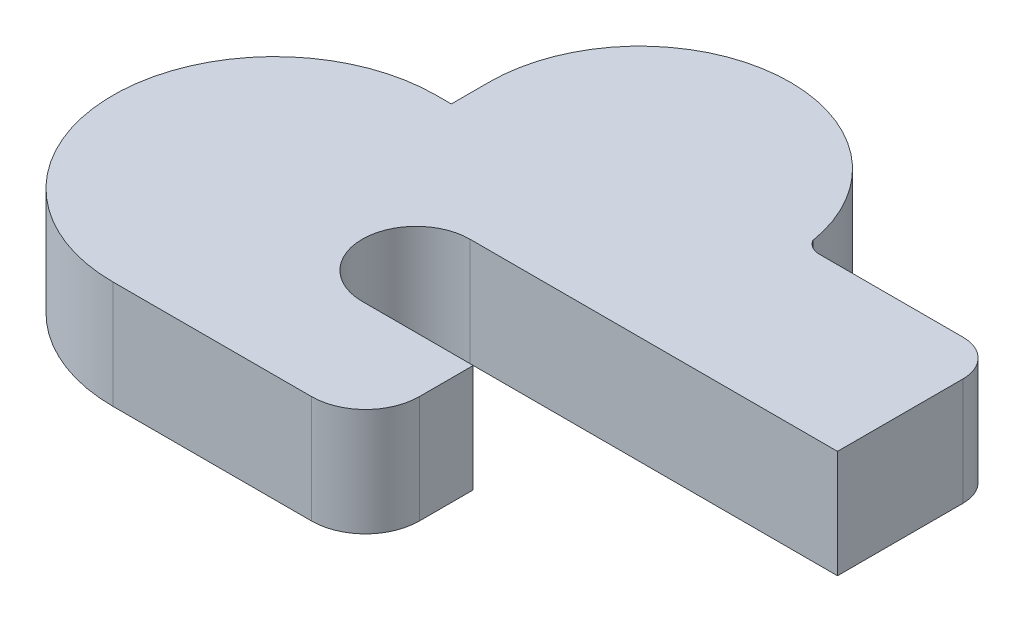
ISO-10303-21;
HEADER;
FILE_DESCRIPTION(('STEP AP214'),'2;1');
FILE_NAME('part.step','',(''),(''),'','','');
FILE_SCHEMA(('AUTOMOTIVE_DESIGN { 1 0 10303 214 1 1 1 1 }'));
ENDSEC;
DATA;
#1=APPLICATION_CONTEXT('core data for automotive mechanical design processes');
#2=APPLICATION_PROTOCOL_DEFINITION('international standard','automotive_design',2000,#1);
#3=PRODUCT_CONTEXT('',#1,'mechanical');
#4=PRODUCT('Part','Part','',(#3));
#5=PRODUCT_RELATED_PRODUCT_CATEGORY('part','',(#4));
#6=PRODUCT_DEFINITION_FORMATION('','',#4);
#7=PRODUCT_DEFINITION_CONTEXT('part definition',#1,'design');
#8=PRODUCT_DEFINITION('design','',#6,#7);
#9=PRODUCT_DEFINITION_SHAPE('','',#8);
#10=(LENGTH_UNIT() NAMED_UNIT(*) SI_UNIT(.MILLI.,.METRE.));
#11=(NAMED_UNIT(*) PLANE_ANGLE_UNIT() SI_UNIT($,.RADIAN.));
#12=(NAMED_UNIT(*) SI_UNIT($,.STERADIAN.) SOLID_ANGLE_UNIT());
#13=UNCERTAINTY_MEASURE_WITH_UNIT(LENGTH_MEASURE(1.E-05),#10,'distance_accuracy_value','');
#14=(GEOMETRIC_REPRESENTATION_CONTEXT(3) GLOBAL_UNCERTAINTY_ASSIGNED_CONTEXT((#13)) GLOBAL_UNIT_ASSIGNED_CONTEXT((#10,
#11,#12)) REPRESENTATION_CONTEXT('',''));
#15=CARTESIAN_POINT('',(0.,0.,0.));
#16=DIRECTION('',(0.,0.,1.));
#17=DIRECTION('',(1.,0.,0.));
#18=AXIS2_PLACEMENT_3D('',#15,#16,#17);
#19=CARTESIAN_POINT('',(0.,3.,1.49999991868153));
#20=DIRECTION('',(-1.,0.,0.));
#21=DIRECTION('',(0.,0.,1.));
#22=AXIS2_PLACEMENT_3D('',#19,#20,#21);
#23=PLANE('',#22);
#24=DIRECTION('',(0.,0.,-1.));
#25=VECTOR('',#24,1.);
#26=CARTESIAN_POINT('',(0.,0.,1.49999991868153));
#27=LINE('',#26,#25);
#28=CARTESIAN_POINT('',(0.,0.,1.49999991868153));
#29=VERTEX_POINT('',#28);
#30=CARTESIAN_POINT('',(0.,0.,0.));
#31=VERTEX_POINT('',#30);
#32=EDGE_CURVE('E165',#29,#31,#27,.T.);
#33=ORIENTED_EDGE('',*,*,#32,.T.);
#34=DIRECTION('',(0.,-1.,0.));
#35=VECTOR('',#34,1.);
#36=CARTESIAN_POINT('',(0.,3.,0.));
#37=LINE('',#36,#35);
#38=CARTESIAN_POINT('',(0.,3.,0.));
#39=VERTEX_POINT('',#38);
#40=EDGE_CURVE('E11',#39,#31,#37,.T.);
#41=ORIENTED_EDGE('',*,*,#40,.F.);
#42=DIRECTION('',(0.,0.,-1.));
#43=VECTOR('',#42,1.);
#44=CARTESIAN_POINT('',(0.,3.,1.49999991868153));
#45=LINE('',#44,#43);
#46=CARTESIAN_POINT('',(0.,3.,1.49999991868153));
#47=VERTEX_POINT('',#46);
#48=EDGE_CURVE('E191',#47,#39,#45,.T.);
#49=ORIENTED_EDGE('',*,*,#48,.F.);
#50=DIRECTION('',(0.,-1.,0.));
#51=VECTOR('',#50,1.);
#52=CARTESIAN_POINT('',(0.,3.,1.49999991868153));
#53=LINE('',#52,#51);
#54=EDGE_CURVE('E161',#47,#29,#53,.T.);
#55=ORIENTED_EDGE('',*,*,#54,.T.);
#56=EDGE_LOOP('',(#33,#41,#49,#55));
#57=FACE_BOUND('',#56,.T.);
#58=ADVANCED_FACE('F33',(#57),#23,.F.);
#59=CARTESIAN_POINT('',(0.,3.,0.));
#60=DIRECTION('',(0.,0.,1.));
#61=DIRECTION('',(1.,0.,0.));
#62=AXIS2_PLACEMENT_3D('',#59,#60,#61);
#63=PLANE('',#62);
#64=DIRECTION('',(-1.,0.,0.));
#65=VECTOR('',#64,1.);
#66=CARTESIAN_POINT('',(0.,0.,0.));
#67=LINE('',#66,#65);
#68=CARTESIAN_POINT('',(-3.09,0.,0.));
#69=VERTEX_POINT('',#68);
#70=EDGE_CURVE('E168',#31,#69,#67,.T.);
#71=ORIENTED_EDGE('',*,*,#70,.T.);
#72=DIRECTION('',(0.,-1.,0.));
#73=VECTOR('',#72,1.);
#74=CARTESIAN_POINT('',(-3.09,3.,0.));
#75=LINE('',#74,#73);
#76=CARTESIAN_POINT('',(-3.09,3.,0.));
#77=VERTEX_POINT('',#76);
#78=EDGE_CURVE('E41',#77,#69,#75,.T.);
#79=ORIENTED_EDGE('',*,*,#78,.F.);
#80=DIRECTION('',(-1.,0.,0.));
#81=VECTOR('',#80,1.);
#82=CARTESIAN_POINT('',(0.,3.,0.));
#83=LINE('',#82,#81);
#84=EDGE_CURVE('E110',#39,#77,#83,.T.);
#85=ORIENTED_EDGE('',*,*,#84,.F.);
#86=ORIENTED_EDGE('',*,*,#40,.T.);
#87=EDGE_LOOP('',(#71,#79,#85,#86));
#88=FACE_BOUND('',#87,.T.);
#89=ADVANCED_FACE('F279',(#88),#63,.F.);
#90=CARTESIAN_POINT('',(-3.09,3.,-1.5));
#91=DIRECTION('',(0.,-1.,0.));
#92=DIRECTION('',(0.,0.,-1.));
#93=AXIS2_PLACEMENT_3D('',#90,#91,#92);
#94=CYLINDRICAL_SURFACE('',#93,1.5);
#95=CARTESIAN_POINT('',(-3.09,0.,-1.5));
#96=DIRECTION('',(0.,-1.,0.));
#97=DIRECTION('',(0.,0.,-1.));
#98=AXIS2_PLACEMENT_3D('',#95,#96,#97);
#99=CIRCLE('',#98,1.5);
#100=CARTESIAN_POINT('',(-3.09,0.,-3.));
#101=VERTEX_POINT('',#100);
#102=EDGE_CURVE('E170',#69,#101,#99,.T.);
#103=ORIENTED_EDGE('',*,*,#102,.T.);
#104=DIRECTION('',(0.,-1.,0.));
#105=VECTOR('',#104,1.);
#106=CARTESIAN_POINT('',(-3.09,3.,-3.));
#107=LINE('',#106,#105);
#108=CARTESIAN_POINT('',(-3.09,3.,-3.));
#109=VERTEX_POINT('',#108);
#110=EDGE_CURVE('E216',#109,#101,#107,.T.);
#111=ORIENTED_EDGE('',*,*,#110,.F.);
#112=CARTESIAN_POINT('',(-3.09,3.,-1.5));
#113=DIRECTION('',(0.,-1.,0.));
#114=DIRECTION('',(0.,0.,-1.));
#115=AXIS2_PLACEMENT_3D('',#112,#113,#114);
#116=CIRCLE('',#115,1.5);
#117=EDGE_CURVE('E224',#77,#109,#116,.T.);
#118=ORIENTED_EDGE('',*,*,#117,.F.);
#119=ORIENTED_EDGE('',*,*,#78,.T.);
#120=EDGE_LOOP('',(#103,#111,#118,#119));
#121=FACE_BOUND('',#120,.T.);
#122=ADVANCED_FACE('F222',(#121),#94,.F.);
#123=CARTESIAN_POINT('',(-3.09,3.,-3.));
#124=DIRECTION('',(0.,0.,-1.));
#125=DIRECTION('',(-1.,0.,0.));
#126=AXIS2_PLACEMENT_3D('',#123,#124,#125);
#127=PLANE('',#126);
#128=DIRECTION('',(1.,0.,0.));
#129=VECTOR('',#128,1.);
#130=CARTESIAN_POINT('',(-3.09,0.,-3.));
#131=LINE('',#130,#129);
#132=CARTESIAN_POINT('',(7.13999997967038,0.,-3.));
#133=VERTEX_POINT('',#132);
#134=EDGE_CURVE('E172',#101,#133,#131,.T.);
#135=ORIENTED_EDGE('',*,*,#134,.T.);
#136=DIRECTION('',(0.,-1.,0.));
#137=VECTOR('',#136,1.);
#138=CARTESIAN_POINT('',(7.13999997967038,3.,-3.));
#139=LINE('',#138,#137);
#140=CARTESIAN_POINT('',(7.13999997967038,3.,-3.));
#141=VERTEX_POINT('',#140);
#142=EDGE_CURVE('E213',#141,#133,#139,.T.);
#143=ORIENTED_EDGE('',*,*,#142,.F.);
#144=DIRECTION('',(1.,0.,0.));
#145=VECTOR('',#144,1.);
#146=CARTESIAN_POINT('',(-3.09,3.,-3.));
#147=LINE('',#146,#145);
#148=EDGE_CURVE('E242',#109,#141,#147,.T.);
#149=ORIENTED_EDGE('',*,*,#148,.F.);
#150=ORIENTED_EDGE('',*,*,#110,.T.);
#151=EDGE_LOOP('',(#135,#143,#149,#150));
#152=FACE_BOUND('',#151,.T.);
#153=ADVANCED_FACE('F233',(#152),#127,.F.);
#154=CARTESIAN_POINT('',(7.13999997967038,3.,-3.));
#155=DIRECTION('',(-1.,0.,0.));
#156=DIRECTION('',(0.,0.,1.));
#157=AXIS2_PLACEMENT_3D('',#154,#155,#156);
#158=PLANE('',#157);
#159=DIRECTION('',(0.,0.,-1.));
#160=VECTOR('',#159,1.);
#161=CARTESIAN_POINT('',(7.13999997967038,0.,-3.));
#162=LINE('',#161,#160);
#163=CARTESIAN_POINT('',(7.13999997967038,0.,-6.5));
#164=VERTEX_POINT('',#163);
#165=EDGE_CURVE('E174',#133,#164,#162,.T.);
#166=ORIENTED_EDGE('',*,*,#165,.T.);
#167=DIRECTION('',(0.,-1.,0.));
#168=VECTOR('',#167,1.);
#169=CARTESIAN_POINT('',(7.13999997967038,3.,-6.5));
#170=LINE('',#169,#168);
#171=CARTESIAN_POINT('',(7.13999997967038,3.,-6.5));
#172=VERTEX_POINT('',#171);
#173=EDGE_CURVE('E210',#172,#164,#170,.T.);
#174=ORIENTED_EDGE('',*,*,#173,.F.);
#175=DIRECTION('',(0.,0.,-1.));
#176=VECTOR('',#175,1.);
#177=CARTESIAN_POINT('',(7.13999997967038,3.,-3.));
#178=LINE('',#177,#176);
#179=EDGE_CURVE('E239',#141,#172,#178,.T.);
#180=ORIENTED_EDGE('',*,*,#179,.F.);
#181=ORIENTED_EDGE('',*,*,#142,.T.);
#182=EDGE_LOOP('',(#166,#174,#180,#181));
#183=FACE_BOUND('',#182,.T.);
#184=ADVANCED_FACE('F237',(#183),#158,.F.);
#185=CARTESIAN_POINT('',(6.13999997967038,3.,-6.5));
#186=DIRECTION('',(0.,-1.,0.));
#187=DIRECTION('',(0.,0.,-1.));
#188=AXIS2_PLACEMENT_3D('',#185,#186,#187);
#189=CYLINDRICAL_SURFACE('',#188,1.);
#190=CARTESIAN_POINT('',(6.13999997967038,0.,-6.5));
#191=DIRECTION('',(0.,1.,0.));
#192=DIRECTION('',(0.,0.,1.));
#193=AXIS2_PLACEMENT_3D('',#190,#191,#192);
#194=CIRCLE('',#193,1.);
#195=CARTESIAN_POINT('',(6.13999997967038,0.,-7.5));
#196=VERTEX_POINT('',#195);
#197=EDGE_CURVE('E176',#164,#196,#194,.T.);
#198=ORIENTED_EDGE('',*,*,#197,.T.);
#199=DIRECTION('',(0.,-1.,0.));
#200=VECTOR('',#199,1.);
#201=CARTESIAN_POINT('',(6.13999997967038,3.,-7.5));
#202=LINE('',#201,#200);
#203=CARTESIAN_POINT('',(6.13999997967038,3.,-7.5));
#204=VERTEX_POINT('',#203);
#205=EDGE_CURVE('E207',#204,#196,#202,.T.);
#206=ORIENTED_EDGE('',*,*,#205,.F.);
#207=CARTESIAN_POINT('',(6.13999997967038,3.,-6.5));
#208=DIRECTION('',(0.,1.,0.));
#209=DIRECTION('',(0.,0.,1.));
#210=AXIS2_PLACEMENT_3D('',#207,#208,#209);
#211=CIRCLE('',#210,1.);
#212=EDGE_CURVE('E241',#172,#204,#211,.T.);
#213=ORIENTED_EDGE('',*,*,#212,.F.);
#214=ORIENTED_EDGE('',*,*,#173,.T.);
#215=EDGE_LOOP('',(#198,#206,#213,#214));
#216=FACE_BOUND('',#215,.T.);
#217=ADVANCED_FACE('F292',(#216),#189,.T.);
#218=CARTESIAN_POINT('',(2.13999997967038,3.,-7.5));
#219=DIRECTION('',(0.,0.,1.));
#220=DIRECTION('',(1.,0.,0.));
#221=AXIS2_PLACEMENT_3D('',#218,#219,#220);
#222=PLANE('',#221);
#223=DIRECTION('',(-1.,0.,0.));
#224=VECTOR('',#223,1.);
#225=CARTESIAN_POINT('',(2.13999997967038,0.,-7.5));
#226=LINE('',#225,#224);
#227=CARTESIAN_POINT('',(2.13999997967038,0.,-7.5));
#228=VERTEX_POINT('',#227);
#229=EDGE_CURVE('E178',#196,#228,#226,.T.);
#230=ORIENTED_EDGE('',*,*,#229,.T.);
#231=DIRECTION('',(0.,-1.,0.));
#232=VECTOR('',#231,1.);
#233=CARTESIAN_POINT('',(2.13999997967038,3.,-7.5));
#234=LINE('',#233,#232);
#235=CARTESIAN_POINT('',(2.13999997967038,3.,-7.5));
#236=VERTEX_POINT('',#235);
#237=EDGE_CURVE('E204',#236,#228,#234,.T.);
#238=ORIENTED_EDGE('',*,*,#237,.F.);
#239=DIRECTION('',(-1.,0.,0.));
#240=VECTOR('',#239,1.);
#241=CARTESIAN_POINT('',(2.13999997967038,3.,-7.5));
#242=LINE('',#241,#240);
#243=EDGE_CURVE('E244',#204,#236,#242,.T.);
#244=ORIENTED_EDGE('',*,*,#243,.F.);
#245=ORIENTED_EDGE('',*,*,#205,.T.);
#246=EDGE_LOOP('',(#230,#238,#244,#245));
#247=FACE_BOUND('',#246,.T.);
#248=ADVANCED_FACE('F295',(#247),#222,.F.);
#249=CARTESIAN_POINT('',(2.13999997967038,3.,-8.));
#250=DIRECTION('',(0.,-1.,0.));
#251=DIRECTION('',(0.,0.,-1.));
#252=AXIS2_PLACEMENT_3D('',#249,#250,#251);
#253=CYLINDRICAL_SURFACE('',#252,0.5);
#254=CARTESIAN_POINT('',(2.13999997967038,0.,-8.));
#255=DIRECTION('',(0.,-1.,0.));
#256=DIRECTION('',(0.,0.,-1.));
#257=AXIS2_PLACEMENT_3D('',#254,#255,#256);
#258=CIRCLE('',#257,0.5);
#259=CARTESIAN_POINT('',(1.71368758019183,0.,-7.73873818103129));
#260=VERTEX_POINT('',#259);
#261=EDGE_CURVE('E180',#228,#260,#258,.T.);
#262=ORIENTED_EDGE('',*,*,#261,.T.);
#263=DIRECTION('',(0.,-1.,0.));
#264=VECTOR('',#263,1.);
#265=CARTESIAN_POINT('',(1.71368758019183,3.,-7.73873818103129));
#266=LINE('',#265,#264);
#267=CARTESIAN_POINT('',(1.71368758019183,3.,-7.73873818103129));
#268=VERTEX_POINT('',#267);
#269=EDGE_CURVE('E201',#268,#260,#266,.T.);
#270=ORIENTED_EDGE('',*,*,#269,.F.);
#271=CARTESIAN_POINT('',(2.13999997967038,3.,-8.));
#272=DIRECTION('',(0.,-1.,0.));
#273=DIRECTION('',(0.,0.,-1.));
#274=AXIS2_PLACEMENT_3D('',#271,#272,#273);
#275=CIRCLE('',#274,0.5);
#276=EDGE_CURVE('E250',#236,#268,#275,.T.);
#277=ORIENTED_EDGE('',*,*,#276,.F.);
#278=ORIENTED_EDGE('',*,*,#237,.T.);
#279=EDGE_LOOP('',(#262,#270,#277,#278));
#280=FACE_BOUND('',#279,.T.);
#281=ADVANCED_FACE('F299',(#280),#253,.F.);
#282=CARTESIAN_POINT('',(-2.42000002032962,3.,-7.05410191169168));
#283=DIRECTION('',(0.,-1.,0.));
#284=DIRECTION('',(0.,0.,-1.));
#285=AXIS2_PLACEMENT_3D('',#282,#283,#284);
#286=CYLINDRICAL_SURFACE('',#285,4.19);
#287=CARTESIAN_POINT('',(-2.42000002032962,0.,-7.05410191169168));
#288=DIRECTION('',(0.,1.,0.));
#289=DIRECTION('',(0.,0.,1.));
#290=AXIS2_PLACEMENT_3D('',#287,#288,#289);
#291=CIRCLE('',#290,4.19);
#292=CARTESIAN_POINT('',(-6.61000002032961,0.,-7.05410191169168));
#293=VERTEX_POINT('',#292);
#294=EDGE_CURVE('E182',#260,#293,#291,.T.);
#295=ORIENTED_EDGE('',*,*,#294,.T.);
#296=DIRECTION('',(0.,-1.,0.));
#297=VECTOR('',#296,1.);
#298=CARTESIAN_POINT('',(-6.61000002032961,3.,-7.05410191169168));
#299=LINE('',#298,#297);
#300=CARTESIAN_POINT('',(-6.61000002032961,3.,-7.05410191169168));
#301=VERTEX_POINT('',#300);
#302=EDGE_CURVE('E198',#301,#293,#299,.T.);
#303=ORIENTED_EDGE('',*,*,#302,.F.);
#304=CARTESIAN_POINT('',(-2.42000002032962,3.,-7.05410191169168));
#305=DIRECTION('',(0.,1.,0.));
#306=DIRECTION('',(0.,0.,1.));
#307=AXIS2_PLACEMENT_3D('',#304,#305,#306);
#308=CIRCLE('',#307,4.19);
#309=EDGE_CURVE('E252',#268,#301,#308,.T.);
#310=ORIENTED_EDGE('',*,*,#309,.F.);
#311=ORIENTED_EDGE('',*,*,#269,.T.);
#312=EDGE_LOOP('',(#295,#303,#310,#311));
#313=FACE_BOUND('',#312,.T.);
#314=ADVANCED_FACE('F303',(#313),#286,.T.);
#315=CARTESIAN_POINT('',(-6.61000002032961,3.,-7.05410191169168));
#316=DIRECTION('',(1.,0.,0.));
#317=DIRECTION('',(0.,0.,-1.));
#318=AXIS2_PLACEMENT_3D('',#315,#316,#317);
#319=PLANE('',#318);
#320=DIRECTION('',(0.,0.,1.));
#321=VECTOR('',#320,1.);
#322=CARTESIAN_POINT('',(-6.61000002032961,0.,-7.05410191169168));
#323=LINE('',#322,#321);
#324=CARTESIAN_POINT('',(-6.61000002032961,0.,-6.));
#325=VERTEX_POINT('',#324);
#326=EDGE_CURVE('E184',#293,#325,#323,.T.);
#327=ORIENTED_EDGE('',*,*,#326,.T.);
#328=DIRECTION('',(0.,-1.,0.));
#329=VECTOR('',#328,1.);
#330=CARTESIAN_POINT('',(-6.61000002032961,3.,-6.));
#331=LINE('',#330,#329);
#332=CARTESIAN_POINT('',(-6.61000002032961,3.,-6.));
#333=VERTEX_POINT('',#332);
#334=EDGE_CURVE('E195',#333,#325,#331,.T.);
#335=ORIENTED_EDGE('',*,*,#334,.F.);
#336=DIRECTION('',(0.,0.,1.));
#337=VECTOR('',#336,1.);
#338=CARTESIAN_POINT('',(-6.61000002032961,3.,-7.05410191169168));
#339=LINE('',#338,#337);
#340=EDGE_CURVE('E254',#301,#333,#339,.T.);
#341=ORIENTED_EDGE('',*,*,#340,.F.);
#342=ORIENTED_EDGE('',*,*,#302,.T.);
#343=EDGE_LOOP('',(#327,#335,#341,#342));
#344=FACE_BOUND('',#343,.T.);
#345=ADVANCED_FACE('F260',(#344),#319,.F.);
#346=CARTESIAN_POINT('',(-6.61000002032961,3.,-6.));
#347=DIRECTION('',(0.,0.,1.));
#348=DIRECTION('',(1.,0.,0.));
#349=AXIS2_PLACEMENT_3D('',#346,#347,#348);
#350=PLANE('',#349);
#351=DIRECTION('',(-1.,0.,0.));
#352=VECTOR('',#351,1.);
#353=CARTESIAN_POINT('',(-6.61000002032961,0.,-6.));
#354=LINE('',#353,#352);
#355=CARTESIAN_POINT('',(-7.03000002032962,0.,-6.));
#356=VERTEX_POINT('',#355);
#357=EDGE_CURVE('E186',#325,#356,#354,.T.);
#358=ORIENTED_EDGE('',*,*,#357,.T.);
#359=DIRECTION('',(0.,-1.,0.));
#360=VECTOR('',#359,1.);
#361=CARTESIAN_POINT('',(-7.03000002032962,3.,-6.));
#362=LINE('',#361,#360);
#363=CARTESIAN_POINT('',(-7.03000002032962,3.,-6.));
#364=VERTEX_POINT('',#363);
#365=EDGE_CURVE('E156',#364,#356,#362,.T.);
#366=ORIENTED_EDGE('',*,*,#365,.F.);
#367=DIRECTION('',(-1.,0.,0.));
#368=VECTOR('',#367,1.);
#369=CARTESIAN_POINT('',(-6.61000002032961,3.,-6.));
#370=LINE('',#369,#368);
#371=EDGE_CURVE('E147',#333,#364,#370,.T.);
#372=ORIENTED_EDGE('',*,*,#371,.F.);
#373=ORIENTED_EDGE('',*,*,#334,.T.);
#374=EDGE_LOOP('',(#358,#366,#372,#373));
#375=FACE_BOUND('',#374,.T.);
#376=ADVANCED_FACE('F264',(#375),#350,.F.);
#377=CARTESIAN_POINT('',(-7.03000002032962,3.,-1.5));
#378=DIRECTION('',(0.,-1.,0.));
#379=DIRECTION('',(0.,0.,-1.));
#380=AXIS2_PLACEMENT_3D('',#377,#378,#379);
#381=CYLINDRICAL_SURFACE('',#380,4.5);
#382=CARTESIAN_POINT('',(-7.03000002032962,0.,-1.5));
#383=DIRECTION('',(0.,1.,0.));
#384=DIRECTION('',(0.,0.,1.));
#385=AXIS2_PLACEMENT_3D('',#382,#383,#384);
#386=CIRCLE('',#385,4.5);
#387=CARTESIAN_POINT('',(-7.03085551215476,0.,2.99999991868152));
#388=VERTEX_POINT('',#387);
#389=EDGE_CURVE('E155',#356,#388,#386,.T.);
#390=ORIENTED_EDGE('',*,*,#389,.T.);
#391=DIRECTION('',(0.,-1.,0.));
#392=VECTOR('',#391,1.);
#393=CARTESIAN_POINT('',(-7.03085551215476,3.,2.99999991868152));
#394=LINE('',#393,#392);
#395=CARTESIAN_POINT('',(-7.03085551215476,3.,2.99999991868152));
#396=VERTEX_POINT('',#395);
#397=EDGE_CURVE('E152',#396,#388,#394,.T.);
#398=ORIENTED_EDGE('',*,*,#397,.F.);
#399=CARTESIAN_POINT('',(-7.03000002032962,3.,-1.5));
#400=DIRECTION('',(0.,1.,0.));
#401=DIRECTION('',(0.,0.,1.));
#402=AXIS2_PLACEMENT_3D('',#399,#400,#401);
#403=CIRCLE('',#402,4.5);
#404=EDGE_CURVE('E141',#364,#396,#403,.T.);
#405=ORIENTED_EDGE('',*,*,#404,.F.);
#406=ORIENTED_EDGE('',*,*,#365,.T.);
#407=EDGE_LOOP('',(#390,#398,#405,#406));
#408=FACE_BOUND('',#407,.T.);
#409=ADVANCED_FACE('F153',(#408),#381,.T.);
#410=CARTESIAN_POINT('',(-7.03085551215476,3.,2.99999991868152));
#411=DIRECTION('',(0.,0.,-1.));
#412=DIRECTION('',(-1.,0.,0.));
#413=AXIS2_PLACEMENT_3D('',#410,#411,#412);
#414=PLANE('',#413);
#415=DIRECTION('',(1.,0.,0.));
#416=VECTOR('',#415,1.);
#417=CARTESIAN_POINT('',(-7.03085551215476,0.,2.99999991868152));
#418=LINE('',#417,#416);
#419=CARTESIAN_POINT('',(-1.5,0.,2.99999991868152));
#420=VERTEX_POINT('',#419);
#421=EDGE_CURVE('E96',#388,#420,#418,.T.);
#422=ORIENTED_EDGE('',*,*,#421,.T.);
#423=DIRECTION('',(0.,-1.,0.));
#424=VECTOR('',#423,1.);
#425=CARTESIAN_POINT('',(-1.5,3.,2.99999991868152));
#426=LINE('',#425,#424);
#427=CARTESIAN_POINT('',(-1.5,3.,2.99999991868152));
#428=VERTEX_POINT('',#427);
#429=EDGE_CURVE('E157',#428,#420,#426,.T.);
#430=ORIENTED_EDGE('',*,*,#429,.F.);
#431=DIRECTION('',(1.,0.,0.));
#432=VECTOR('',#431,1.);
#433=CARTESIAN_POINT('',(-7.03085551215476,3.,2.99999991868152));
#434=LINE('',#433,#432);
#435=EDGE_CURVE('E145',#396,#428,#434,.T.);
#436=ORIENTED_EDGE('',*,*,#435,.F.);
#437=ORIENTED_EDGE('',*,*,#397,.T.);
#438=EDGE_LOOP('',(#422,#430,#436,#437));
#439=FACE_BOUND('',#438,.T.);
#440=ADVANCED_FACE('F159',(#439),#414,.F.);
#441=CARTESIAN_POINT('',(-1.5,3.,1.49999991868153));
#442=DIRECTION('',(0.,-1.,0.));
#443=DIRECTION('',(0.,0.,-1.));
#444=AXIS2_PLACEMENT_3D('',#441,#442,#443);
#445=CYLINDRICAL_SURFACE('',#444,1.5);
#446=CARTESIAN_POINT('',(-1.5,0.,1.49999991868153));
#447=DIRECTION('',(0.,1.,0.));
#448=DIRECTION('',(0.,0.,1.));
#449=AXIS2_PLACEMENT_3D('',#446,#447,#448);
#450=CIRCLE('',#449,1.5);
#451=EDGE_CURVE('E102',#420,#29,#450,.T.);
#452=ORIENTED_EDGE('',*,*,#451,.T.);
#453=ORIENTED_EDGE('',*,*,#54,.F.);
#454=CARTESIAN_POINT('',(-1.5,3.,1.49999991868153));
#455=DIRECTION('',(0.,1.,0.));
#456=DIRECTION('',(0.,0.,1.));
#457=AXIS2_PLACEMENT_3D('',#454,#455,#456);
#458=CIRCLE('',#457,1.5);
#459=EDGE_CURVE('E49',#428,#47,#458,.T.);
#460=ORIENTED_EDGE('',*,*,#459,.F.);
#461=ORIENTED_EDGE('',*,*,#429,.T.);
#462=EDGE_LOOP('',(#452,#453,#460,#461));
#463=FACE_BOUND('',#462,.T.);
#464=ADVANCED_FACE('F268',(#463),#445,.T.);
#465=CARTESIAN_POINT('',(-3.09,3.,-1.5));
#466=DIRECTION('',(0.,-1.,0.));
#467=DIRECTION('',(0.,0.,-1.));
#468=AXIS2_PLACEMENT_3D('',#465,#466,#467);
#469=PLANE('',#468);
#470=ORIENTED_EDGE('',*,*,#48,.T.);
#471=ORIENTED_EDGE('',*,*,#84,.T.);
#472=ORIENTED_EDGE('',*,*,#117,.T.);
#473=ORIENTED_EDGE('',*,*,#148,.T.);
#474=ORIENTED_EDGE('',*,*,#179,.T.);
#475=ORIENTED_EDGE('',*,*,#212,.T.);
#476=ORIENTED_EDGE('',*,*,#243,.T.);
#477=ORIENTED_EDGE('',*,*,#276,.T.);
#478=ORIENTED_EDGE('',*,*,#309,.T.);
#479=ORIENTED_EDGE('',*,*,#340,.T.);
#480=ORIENTED_EDGE('',*,*,#371,.T.);
#481=ORIENTED_EDGE('',*,*,#404,.T.);
#482=ORIENTED_EDGE('',*,*,#435,.T.);
#483=ORIENTED_EDGE('',*,*,#459,.T.);
#484=EDGE_LOOP('',(#470,#471,#472,#473,#474,#475,#476,#477,#478,#479,#480,#481,#482,#483));
#485=FACE_BOUND('',#484,.T.);
#486=ADVANCED_FACE('F143',(#485),#469,.F.);
#487=CARTESIAN_POINT('',(-3.09,0.,-1.5));
#488=DIRECTION('',(0.,-1.,0.));
#489=DIRECTION('',(0.,0.,-1.));
#490=AXIS2_PLACEMENT_3D('',#487,#488,#489);
#491=PLANE('',#490);
#492=ORIENTED_EDGE('',*,*,#32,.F.);
#493=ORIENTED_EDGE('',*,*,#451,.F.);
#494=ORIENTED_EDGE('',*,*,#421,.F.);
#495=ORIENTED_EDGE('',*,*,#389,.F.);
#496=ORIENTED_EDGE('',*,*,#357,.F.);
#497=ORIENTED_EDGE('',*,*,#326,.F.);
#498=ORIENTED_EDGE('',*,*,#294,.F.);
#499=ORIENTED_EDGE('',*,*,#261,.F.);
#500=ORIENTED_EDGE('',*,*,#229,.F.);
#501=ORIENTED_EDGE('',*,*,#197,.F.);
#502=ORIENTED_EDGE('',*,*,#165,.F.);
#503=ORIENTED_EDGE('',*,*,#134,.F.);
#504=ORIENTED_EDGE('',*,*,#102,.F.);
#505=ORIENTED_EDGE('',*,*,#70,.F.);
#506=EDGE_LOOP('',(#492,#493,#494,#495,#496,#497,#498,#499,#500,#501,#502,#503,#504,#505));
#507=FACE_BOUND('',#506,.T.);
#508=ADVANCED_FACE('F228',(#507),#491,.T.);
#509=CLOSED_SHELL('',(#58,#89,#122,#153,#184,#217,#248,#281,#314,#345,#376,#409,#440,#464,#486,#508));
#510=MANIFOLD_SOLID_BREP('B2',#509);
#511=ADVANCED_BREP_SHAPE_REPRESENTATION('',(#18,#510),#14);
#512=SHAPE_DEFINITION_REPRESENTATION(#9,#511);
ENDSEC;
END-ISO-10303-21;
